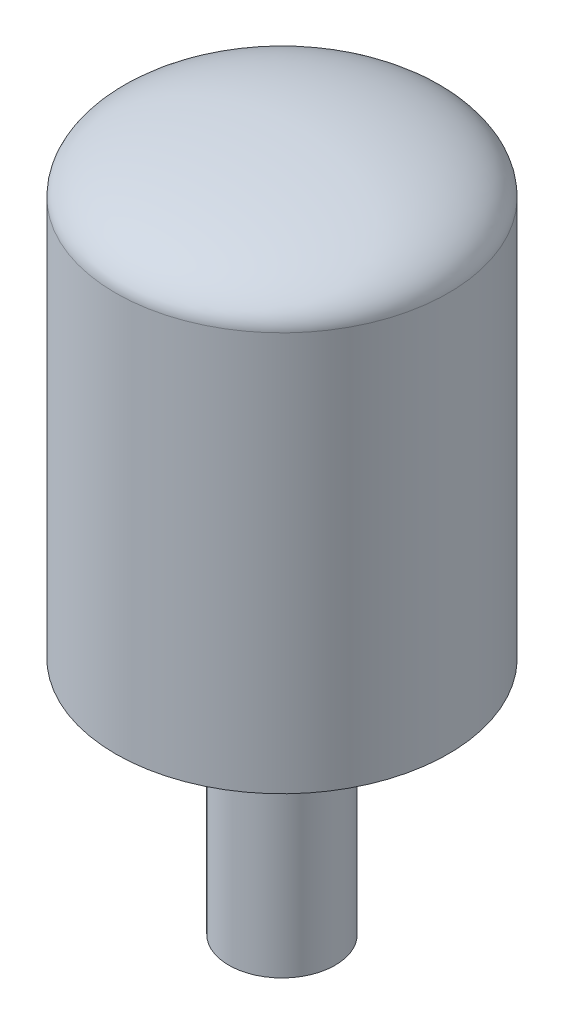
ISO-10303-21;
HEADER;
FILE_DESCRIPTION(('STEP AP214'),'2;1');
FILE_NAME('part.step','',(''),(''),'','','');
FILE_SCHEMA(('AUTOMOTIVE_DESIGN { 1 0 10303 214 1 1 1 1 }'));
ENDSEC;
DATA;
#1=APPLICATION_CONTEXT('core data for automotive mechanical design processes');
#2=APPLICATION_PROTOCOL_DEFINITION('international standard','automotive_design',2000,#1);
#3=PRODUCT_CONTEXT('',#1,'mechanical');
#4=PRODUCT('Part','Part','',(#3));
#5=PRODUCT_RELATED_PRODUCT_CATEGORY('part','',(#4));
#6=PRODUCT_DEFINITION_FORMATION('','',#4);
#7=PRODUCT_DEFINITION_CONTEXT('part definition',#1,'design');
#8=PRODUCT_DEFINITION('design','',#6,#7);
#9=PRODUCT_DEFINITION_SHAPE('','',#8);
#10=(LENGTH_UNIT() NAMED_UNIT(*) SI_UNIT(.MILLI.,.METRE.));
#11=(NAMED_UNIT(*) PLANE_ANGLE_UNIT() SI_UNIT($,.RADIAN.));
#12=(NAMED_UNIT(*) SI_UNIT($,.STERADIAN.) SOLID_ANGLE_UNIT());
#13=UNCERTAINTY_MEASURE_WITH_UNIT(LENGTH_MEASURE(1.E-05),#10,'distance_accuracy_value','');
#14=(GEOMETRIC_REPRESENTATION_CONTEXT(3) GLOBAL_UNCERTAINTY_ASSIGNED_CONTEXT((#13)) GLOBAL_UNIT_ASSIGNED_CONTEXT((#10,
#11,#12)) REPRESENTATION_CONTEXT('',''));
#15=CARTESIAN_POINT('',(0.,0.,0.));
#16=DIRECTION('',(0.,0.,1.));
#17=DIRECTION('',(1.,0.,0.));
#18=AXIS2_PLACEMENT_3D('',#15,#16,#17);
#19=CARTESIAN_POINT('',(0.,0.,0.));
#20=DIRECTION('',(0.,1.,0.));
#21=DIRECTION('',(0.,0.,1.));
#22=AXIS2_PLACEMENT_3D('',#19,#20,#21);
#23=PLANE('',#22);
#24=CARTESIAN_POINT('',(0.,0.,0.));
#25=DIRECTION('',(0.,-1.,0.));
#26=DIRECTION('',(0.,0.,-1.));
#27=AXIS2_PLACEMENT_3D('',#24,#25,#26);
#28=CIRCLE('',#27,2.54);
#29=CARTESIAN_POINT('',(0.,0.,-2.54));
#30=VERTEX_POINT('',#29);
#31=EDGE_CURVE('E11',#30,#30,#28,.T.);
#32=ORIENTED_EDGE('',*,*,#31,.F.);
#33=EDGE_LOOP('',(#32));
#34=FACE_BOUND('',#33,.T.);
#35=CARTESIAN_POINT('',(0.,0.,0.));
#36=DIRECTION('',(0.,1.,0.));
#37=DIRECTION('',(0.,0.,1.));
#38=AXIS2_PLACEMENT_3D('',#35,#36,#37);
#39=CIRCLE('',#38,7.9375);
#40=CARTESIAN_POINT('',(0.,0.,7.9375));
#41=VERTEX_POINT('',#40);
#42=EDGE_CURVE('E44',#41,#41,#39,.T.);
#43=ORIENTED_EDGE('',*,*,#42,.F.);
#44=EDGE_LOOP('',(#43));
#45=FACE_BOUND('',#44,.T.);
#46=ADVANCED_FACE('F41',(#34,#45),#23,.F.);
#47=CARTESIAN_POINT('',(0.,21.7918099633204,0.));
#48=DIRECTION('',(0.,1.,0.));
#49=DIRECTION('',(0.,0.,1.));
#50=AXIS2_PLACEMENT_3D('',#47,#48,#49);
#51=CYLINDRICAL_SURFACE('',#50,7.9375);
#52=CARTESIAN_POINT('',(0.,19.05,0.));
#53=DIRECTION('',(0.,1.,0.));
#54=DIRECTION('',(0.,0.,1.));
#55=AXIS2_PLACEMENT_3D('',#52,#53,#54);
#56=CIRCLE('',#55,7.9375);
#57=CARTESIAN_POINT('',(0.,19.05,7.9375));
#58=VERTEX_POINT('',#57);
#59=EDGE_CURVE('E60',#58,#58,#56,.T.);
#60=ORIENTED_EDGE('',*,*,#59,.F.);
#61=EDGE_LOOP('',(#60));
#62=FACE_BOUND('',#61,.T.);
#63=ORIENTED_EDGE('',*,*,#42,.T.);
#64=EDGE_LOOP('',(#63));
#65=FACE_BOUND('',#64,.T.);
#66=ADVANCED_FACE('F56',(#62,#65),#51,.T.);
#67=CARTESIAN_POINT('',(0.,19.05,0.));
#68=DIRECTION('',(1.,0.,0.));
#69=DIRECTION('',(0.,0.,-1.));
#70=AXIS2_PLACEMENT_3D('',#67,#68,#69);
#71=ELLIPSE('',#70,7.9375,2.74180996332036);
#72=TRIMMED_CURVE('',#71,(PARAMETER_VALUE(-1.5707963267949)),(PARAMETER_VALUE(1.5707963267949)),
.T.,.PARAMETER.);
#73=CARTESIAN_POINT('',(0.,21.7918099633204,0.));
#74=DIRECTION('',(0.,1.,0.));
#75=AXIS1_PLACEMENT('',#73,#74);
#76=SURFACE_OF_REVOLUTION('',#72,#75);
#77=CARTESIAN_POINT('',(0.,21.7918099633204,0.));
#78=VERTEX_POINT('',#77);
#79=VERTEX_LOOP('',#78);
#80=FACE_BOUND('',#79,.T.);
#81=ORIENTED_EDGE('',*,*,#59,.T.);
#82=EDGE_LOOP('',(#81));
#83=FACE_BOUND('',#82,.T.);
#84=ADVANCED_FACE('F52',(#80,#83),#76,.T.);
#85=CARTESIAN_POINT('',(0.,-11.43,0.));
#86=DIRECTION('',(0.,1.,0.));
#87=DIRECTION('',(0.,0.,1.));
#88=AXIS2_PLACEMENT_3D('',#85,#86,#87);
#89=CYLINDRICAL_SURFACE('',#88,2.54);
#90=CARTESIAN_POINT('',(0.,-11.43,0.));
#91=DIRECTION('',(0.,-1.,0.));
#92=DIRECTION('',(0.,0.,-1.));
#93=AXIS2_PLACEMENT_3D('',#90,#91,#92);
#94=CIRCLE('',#93,2.54);
#95=CARTESIAN_POINT('',(0.,-11.43,-2.54));
#96=VERTEX_POINT('',#95);
#97=EDGE_CURVE('E63',#96,#96,#94,.T.);
#98=ORIENTED_EDGE('',*,*,#97,.F.);
#99=EDGE_LOOP('',(#98));
#100=FACE_BOUND('',#99,.T.);
#101=ORIENTED_EDGE('',*,*,#31,.T.);
#102=EDGE_LOOP('',(#101));
#103=FACE_BOUND('',#102,.T.);
#104=ADVANCED_FACE('F55',(#100,#103),#89,.T.);
#105=CARTESIAN_POINT('',(0.,-11.43,0.));
#106=DIRECTION('',(0.,-1.,0.));
#107=DIRECTION('',(0.,0.,-1.));
#108=AXIS2_PLACEMENT_3D('',#105,#106,#107);
#109=PLANE('',#108);
#110=ORIENTED_EDGE('',*,*,#97,.T.);
#111=EDGE_LOOP('',(#110));
#112=FACE_BOUND('',#111,.T.);
#113=ADVANCED_FACE('F86',(#112),#109,.T.);
#114=CLOSED_SHELL('',(#46,#66,#84,#104,#113));
#115=MANIFOLD_SOLID_BREP('B2',#114);
#116=ADVANCED_BREP_SHAPE_REPRESENTATION('',(#18,#115),#14);
#117=SHAPE_DEFINITION_REPRESENTATION(#9,#116);
ENDSEC;
END-ISO-10303-21;
